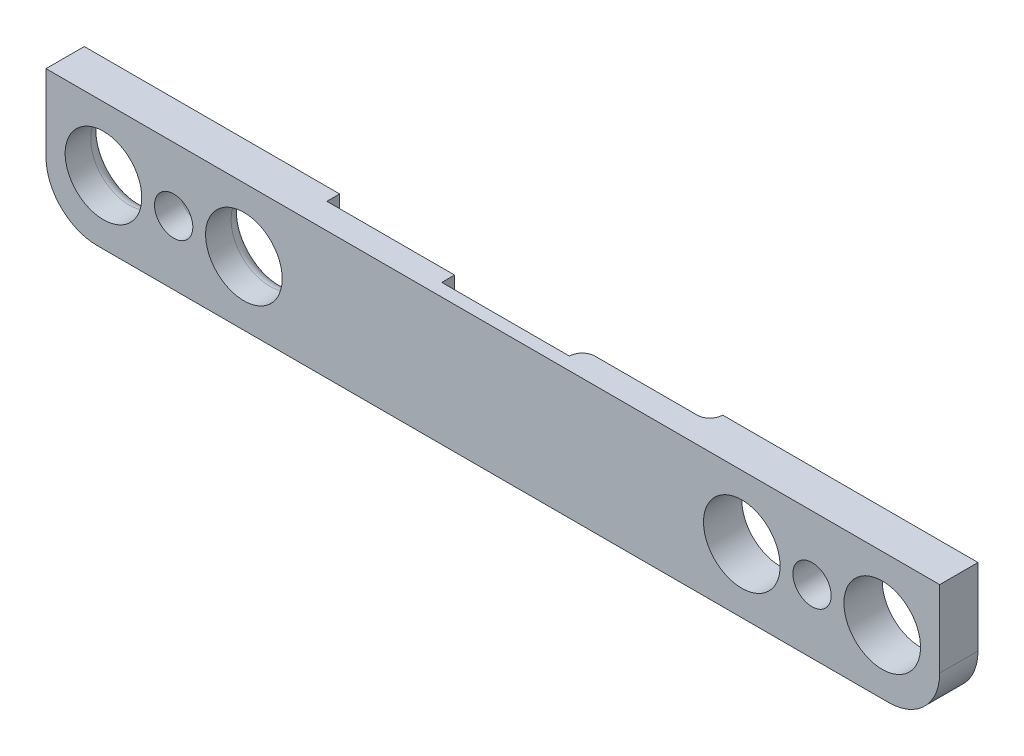
ISO-10303-21;
HEADER;
FILE_DESCRIPTION(('STEP AP214'),'2;1');
FILE_NAME('part.step','',(''),(''),'','','');
FILE_SCHEMA(('AUTOMOTIVE_DESIGN { 1 0 10303 214 1 1 1 1 }'));
ENDSEC;
DATA;
#1=APPLICATION_CONTEXT('core data for automotive mechanical design processes');
#2=APPLICATION_PROTOCOL_DEFINITION('international standard','automotive_design',2000,#1);
#3=PRODUCT_CONTEXT('',#1,'mechanical');
#4=PRODUCT('Part','Part','',(#3));
#5=PRODUCT_RELATED_PRODUCT_CATEGORY('part','',(#4));
#6=PRODUCT_DEFINITION_FORMATION('','',#4);
#7=PRODUCT_DEFINITION_CONTEXT('part definition',#1,'design');
#8=PRODUCT_DEFINITION('design','',#6,#7);
#9=PRODUCT_DEFINITION_SHAPE('','',#8);
#10=(LENGTH_UNIT() NAMED_UNIT(*) SI_UNIT(.MILLI.,.METRE.));
#11=(NAMED_UNIT(*) PLANE_ANGLE_UNIT() SI_UNIT($,.RADIAN.));
#12=(NAMED_UNIT(*) SI_UNIT($,.STERADIAN.) SOLID_ANGLE_UNIT());
#13=UNCERTAINTY_MEASURE_WITH_UNIT(LENGTH_MEASURE(1.E-05),#10,'distance_accuracy_value','');
#14=(GEOMETRIC_REPRESENTATION_CONTEXT(3) GLOBAL_UNCERTAINTY_ASSIGNED_CONTEXT((#13)) GLOBAL_UNIT_ASSIGNED_CONTEXT((#10,
#11,#12)) REPRESENTATION_CONTEXT('',''));
#15=CARTESIAN_POINT('',(0.,0.,0.));
#16=DIRECTION('',(0.,0.,1.));
#17=DIRECTION('',(1.,0.,0.));
#18=AXIS2_PLACEMENT_3D('',#15,#16,#17);
#19=CARTESIAN_POINT('',(21.1434977578475,6.18834080717489,1.));
#20=DIRECTION('',(1.,0.,0.));
#21=DIRECTION('',(0.,0.,-1.));
#22=AXIS2_PLACEMENT_3D('',#19,#20,#21);
#23=PLANE('',#22);
#24=DIRECTION('',(0.,0.,1.));
#25=VECTOR('',#24,1.);
#26=CARTESIAN_POINT('',(21.1434977578475,6.18834080717489,1.));
#27=LINE('',#26,#25);
#28=CARTESIAN_POINT('',(21.1434977578475,6.18834080717489,1.));
#29=VERTEX_POINT('',#28);
#30=CARTESIAN_POINT('',(21.1434977578475,6.18834080717489,2.));
#31=VERTEX_POINT('',#30);
#32=EDGE_CURVE('E446',#29,#31,#27,.T.);
#33=ORIENTED_EDGE('',*,*,#32,.T.);
#34=DIRECTION('',(0.,-1.,0.));
#35=VECTOR('',#34,1.);
#36=CARTESIAN_POINT('',(21.1434977578475,6.18834080717489,2.));
#37=LINE('',#36,#35);
#38=CARTESIAN_POINT('',(21.1434977578475,-3.81165919282511,2.));
#39=VERTEX_POINT('',#38);
#40=EDGE_CURVE('E174',#31,#39,#37,.T.);
#41=ORIENTED_EDGE('',*,*,#40,.T.);
#42=DIRECTION('',(0.,0.,1.));
#43=VECTOR('',#42,1.);
#44=CARTESIAN_POINT('',(21.1434977578475,-3.81165919282511,1.));
#45=LINE('',#44,#43);
#46=CARTESIAN_POINT('',(21.1434977578475,-3.81165919282511,1.));
#47=VERTEX_POINT('',#46);
#48=EDGE_CURVE('E450',#47,#39,#45,.T.);
#49=ORIENTED_EDGE('',*,*,#48,.F.);
#50=DIRECTION('',(0.,1.,0.));
#51=VECTOR('',#50,1.);
#52=CARTESIAN_POINT('',(21.1434977578475,6.18834080717489,1.));
#53=LINE('',#52,#51);
#54=EDGE_CURVE('E437',#47,#29,#53,.T.);
#55=ORIENTED_EDGE('',*,*,#54,.T.);
#56=EDGE_LOOP('',(#33,#41,#49,#55));
#57=FACE_BOUND('',#56,.T.);
#58=ADVANCED_FACE('F35',(#57),#23,.T.);
#59=CARTESIAN_POINT('',(0.,0.,3.));
#60=DIRECTION('',(0.,0.,1.));
#61=DIRECTION('',(1.,0.,0.));
#62=AXIS2_PLACEMENT_3D('',#59,#60,#61);
#63=PLANE('',#62);
#64=DIRECTION('',(0.,-1.,0.));
#65=VECTOR('',#64,1.);
#66=CARTESIAN_POINT('',(-8.85650224215246,6.18834080717489,3.));
#67=LINE('',#66,#65);
#68=CARTESIAN_POINT('',(-8.85650224215246,6.18834080717489,3.));
#69=VERTEX_POINT('',#68);
#70=CARTESIAN_POINT('',(-8.85650224215246,0.188340807174886,3.));
#71=VERTEX_POINT('',#70);
#72=EDGE_CURVE('E417',#69,#71,#67,.T.);
#73=ORIENTED_EDGE('',*,*,#72,.T.);
#74=CARTESIAN_POINT('',(-4.85650224215246,0.188340807174886,3.));
#75=DIRECTION('',(0.,0.,1.));
#76=DIRECTION('',(1.,0.,0.));
#77=AXIS2_PLACEMENT_3D('',#74,#75,#76);
#78=CIRCLE('',#77,4.);
#79=CARTESIAN_POINT('',(-4.85650224215246,-3.81165919282511,3.));
#80=VERTEX_POINT('',#79);
#81=EDGE_CURVE('E466',#71,#80,#78,.T.);
#82=ORIENTED_EDGE('',*,*,#81,.T.);
#83=DIRECTION('',(1.,0.,0.));
#84=VECTOR('',#83,1.);
#85=CARTESIAN_POINT('',(-8.85650224215246,-3.81165919282511,3.));
#86=LINE('',#85,#84);
#87=CARTESIAN_POINT('',(57.1434977578475,-3.81165919282511,3.));
#88=VERTEX_POINT('',#87);
#89=EDGE_CURVE('E485',#80,#88,#86,.T.);
#90=ORIENTED_EDGE('',*,*,#89,.T.);
#91=CARTESIAN_POINT('',(57.1434977578475,0.188340807174886,3.));
#92=DIRECTION('',(0.,0.,1.));
#93=DIRECTION('',(1.,0.,0.));
#94=AXIS2_PLACEMENT_3D('',#91,#92,#93);
#95=CIRCLE('',#94,4.);
#96=CARTESIAN_POINT('',(61.1434977578476,0.188340807174886,3.));
#97=VERTEX_POINT('',#96);
#98=EDGE_CURVE('E464',#88,#97,#95,.T.);
#99=ORIENTED_EDGE('',*,*,#98,.T.);
#100=DIRECTION('',(0.,-1.,0.));
#101=VECTOR('',#100,1.);
#102=CARTESIAN_POINT('',(61.1434977578476,6.18834080717489,3.));
#103=LINE('',#102,#101);
#104=CARTESIAN_POINT('',(61.1434977578476,6.18834080717489,3.));
#105=VERTEX_POINT('',#104);
#106=EDGE_CURVE('E213',#105,#97,#103,.T.);
#107=ORIENTED_EDGE('',*,*,#106,.F.);
#108=DIRECTION('',(-1.,0.,0.));
#109=VECTOR('',#108,1.);
#110=CARTESIAN_POINT('',(-8.85650224215246,6.18834080717489,3.));
#111=LINE('',#110,#109);
#112=EDGE_CURVE('E422',#105,#69,#111,.T.);
#113=ORIENTED_EDGE('',*,*,#112,.T.);
#114=EDGE_LOOP('',(#73,#82,#90,#99,#107,#113));
#115=FACE_BOUND('',#114,.T.);
#116=CARTESIAN_POINT('',(6.64349775784754,1.18834080717489,3.));
#117=DIRECTION('',(0.,0.,1.));
#118=DIRECTION('',(1.,0.,0.));
#119=AXIS2_PLACEMENT_3D('',#116,#117,#118);
#120=CIRCLE('',#119,3.);
#121=CARTESIAN_POINT('',(9.64349775784754,1.18834080717489,3.));
#122=VERTEX_POINT('',#121);
#123=EDGE_CURVE('E508',#122,#122,#120,.T.);
#124=ORIENTED_EDGE('',*,*,#123,.F.);
#125=EDGE_LOOP('',(#124));
#126=FACE_BOUND('',#125,.T.);
#127=CARTESIAN_POINT('',(-4.35650224215246,1.18834080717489,3.));
#128=DIRECTION('',(0.,0.,1.));
#129=DIRECTION('',(1.,0.,0.));
#130=AXIS2_PLACEMENT_3D('',#127,#128,#129);
#131=CIRCLE('',#130,3.);
#132=CARTESIAN_POINT('',(-1.35650224215246,1.18834080717489,3.));
#133=VERTEX_POINT('',#132);
#134=EDGE_CURVE('E412',#133,#133,#131,.T.);
#135=ORIENTED_EDGE('',*,*,#134,.F.);
#136=EDGE_LOOP('',(#135));
#137=FACE_BOUND('',#136,.T.);
#138=CARTESIAN_POINT('',(1.14349775784754,1.18834080717489,3.));
#139=DIRECTION('',(0.,0.,1.));
#140=DIRECTION('',(1.,0.,0.));
#141=AXIS2_PLACEMENT_3D('',#138,#139,#140);
#142=CIRCLE('',#141,1.5);
#143=CARTESIAN_POINT('',(2.64349775784754,1.18834080717489,3.));
#144=VERTEX_POINT('',#143);
#145=EDGE_CURVE('E449',#144,#144,#142,.T.);
#146=ORIENTED_EDGE('',*,*,#145,.F.);
#147=EDGE_LOOP('',(#146));
#148=FACE_BOUND('',#147,.T.);
#149=CARTESIAN_POINT('',(45.6434977578475,1.18834080717489,3.));
#150=DIRECTION('',(0.,0.,-1.));
#151=DIRECTION('',(-1.,0.,0.));
#152=AXIS2_PLACEMENT_3D('',#149,#150,#151);
#153=CIRCLE('',#152,3.);
#154=CARTESIAN_POINT('',(42.6434977578475,1.18834080717489,3.));
#155=VERTEX_POINT('',#154);
#156=EDGE_CURVE('E201',#155,#155,#153,.T.);
#157=ORIENTED_EDGE('',*,*,#156,.T.);
#158=EDGE_LOOP('',(#157));
#159=FACE_BOUND('',#158,.T.);
#160=CARTESIAN_POINT('',(56.6434977578475,1.18834080717489,3.));
#161=DIRECTION('',(0.,0.,-1.));
#162=DIRECTION('',(-1.,0.,0.));
#163=AXIS2_PLACEMENT_3D('',#160,#161,#162);
#164=CIRCLE('',#163,3.);
#165=CARTESIAN_POINT('',(53.6434977578475,1.18834080717489,3.));
#166=VERTEX_POINT('',#165);
#167=EDGE_CURVE('E207',#166,#166,#164,.T.);
#168=ORIENTED_EDGE('',*,*,#167,.T.);
#169=EDGE_LOOP('',(#168));
#170=FACE_BOUND('',#169,.T.);
#171=CARTESIAN_POINT('',(51.1434977578475,1.18834080717489,3.));
#172=DIRECTION('',(0.,0.,-1.));
#173=DIRECTION('',(-1.,0.,0.));
#174=AXIS2_PLACEMENT_3D('',#171,#172,#173);
#175=CIRCLE('',#174,1.5);
#176=CARTESIAN_POINT('',(49.6434977578475,1.18834080717489,3.));
#177=VERTEX_POINT('',#176);
#178=EDGE_CURVE('E194',#177,#177,#175,.T.);
#179=ORIENTED_EDGE('',*,*,#178,.T.);
#180=EDGE_LOOP('',(#179));
#181=FACE_BOUND('',#180,.T.);
#182=ADVANCED_FACE('F282',(#115,#126,#137,#148,#159,#170,#181),#63,.T.);
#183=CARTESIAN_POINT('',(0.,0.,0.));
#184=DIRECTION('',(0.,0.,1.));
#185=DIRECTION('',(1.,0.,0.));
#186=AXIS2_PLACEMENT_3D('',#183,#184,#185);
#187=PLANE('',#186);
#188=CARTESIAN_POINT('',(1.14349775784754,1.18834080717489,0.));
#189=DIRECTION('',(0.,0.,1.));
#190=DIRECTION('',(1.,0.,0.));
#191=AXIS2_PLACEMENT_3D('',#188,#189,#190);
#192=CIRCLE('',#191,2.5);
#193=CARTESIAN_POINT('',(3.00713412148391,2.85473196897701,0.));
#194=VERTEX_POINT('',#193);
#195=CARTESIAN_POINT('',(-0.72013860578882,2.85473196897701,0.));
#196=VERTEX_POINT('',#195);
#197=EDGE_CURVE('E251',#194,#196,#192,.T.);
#198=ORIENTED_EDGE('',*,*,#197,.T.);
#199=CARTESIAN_POINT('',(-4.35650224215246,1.18834080717489,0.));
#200=DIRECTION('',(0.,0.,1.));
#201=DIRECTION('',(1.,0.,0.));
#202=AXIS2_PLACEMENT_3D('',#199,#200,#201);
#203=CIRCLE('',#202,4.);
#204=CARTESIAN_POINT('',(-0.72013860578882,-0.478050354627238,0.));
#205=VERTEX_POINT('',#204);
#206=EDGE_CURVE('E63',#196,#205,#203,.T.);
#207=ORIENTED_EDGE('',*,*,#206,.T.);
#208=CARTESIAN_POINT('',(1.14349775784754,1.18834080717489,0.));
#209=DIRECTION('',(0.,0.,1.));
#210=DIRECTION('',(1.,0.,0.));
#211=AXIS2_PLACEMENT_3D('',#208,#209,#210);
#212=CIRCLE('',#211,2.5);
#213=CARTESIAN_POINT('',(3.00713412148391,-0.478050354627236,0.));
#214=VERTEX_POINT('',#213);
#215=EDGE_CURVE('E249',#205,#214,#212,.T.);
#216=ORIENTED_EDGE('',*,*,#215,.T.);
#217=CARTESIAN_POINT('',(6.64349775784754,1.18834080717489,0.));
#218=DIRECTION('',(0.,0.,1.));
#219=DIRECTION('',(1.,0.,0.));
#220=AXIS2_PLACEMENT_3D('',#217,#218,#219);
#221=CIRCLE('',#220,4.);
#222=EDGE_CURVE('E247',#214,#194,#221,.T.);
#223=ORIENTED_EDGE('',*,*,#222,.T.);
#224=EDGE_LOOP('',(#198,#207,#216,#223));
#225=FACE_BOUND('',#224,.T.);
#226=DIRECTION('',(1.,0.,0.));
#227=VECTOR('',#226,1.);
#228=CARTESIAN_POINT('',(-8.85650224215246,-3.81165919282511,0.));
#229=LINE('',#228,#227);
#230=CARTESIAN_POINT('',(-4.85650224215246,-3.81165919282511,0.));
#231=VERTEX_POINT('',#230);
#232=CARTESIAN_POINT('',(11.1434977578475,-3.81165919282511,0.));
#233=VERTEX_POINT('',#232);
#234=EDGE_CURVE('E398',#231,#233,#229,.T.);
#235=ORIENTED_EDGE('',*,*,#234,.F.);
#236=CARTESIAN_POINT('',(-4.85650224215246,0.188340807174886,0.));
#237=DIRECTION('',(0.,0.,1.));
#238=DIRECTION('',(1.,0.,0.));
#239=AXIS2_PLACEMENT_3D('',#236,#237,#238);
#240=CIRCLE('',#239,4.);
#241=CARTESIAN_POINT('',(-8.85650224215246,0.188340807174886,0.));
#242=VERTEX_POINT('',#241);
#243=EDGE_CURVE('E400',#231,#242,#240,.F.);
#244=ORIENTED_EDGE('',*,*,#243,.T.);
#245=DIRECTION('',(0.,-1.,0.));
#246=VECTOR('',#245,1.);
#247=CARTESIAN_POINT('',(-8.85650224215246,6.18834080717489,0.));
#248=LINE('',#247,#246);
#249=CARTESIAN_POINT('',(-8.85650224215246,6.18834080717489,0.));
#250=VERTEX_POINT('',#249);
#251=EDGE_CURVE('E408',#250,#242,#248,.T.);
#252=ORIENTED_EDGE('',*,*,#251,.F.);
#253=DIRECTION('',(-1.,0.,0.));
#254=VECTOR('',#253,1.);
#255=CARTESIAN_POINT('',(-8.85650224215246,6.18834080717489,0.));
#256=LINE('',#255,#254);
#257=CARTESIAN_POINT('',(11.1434977578475,6.18834080717489,0.));
#258=VERTEX_POINT('',#257);
#259=EDGE_CURVE('E410',#258,#250,#256,.T.);
#260=ORIENTED_EDGE('',*,*,#259,.F.);
#261=DIRECTION('',(0.,1.,0.));
#262=VECTOR('',#261,1.);
#263=CARTESIAN_POINT('',(11.1434977578475,6.18834080717489,0.));
#264=LINE('',#263,#262);
#265=EDGE_CURVE('E404',#233,#258,#264,.T.);
#266=ORIENTED_EDGE('',*,*,#265,.F.);
#267=EDGE_LOOP('',(#235,#244,#252,#260,#266));
#268=FACE_BOUND('',#267,.T.);
#269=ADVANCED_FACE('F288',(#225,#268),#187,.F.);
#270=CARTESIAN_POINT('',(-8.85650224215246,6.18834080717489,3.));
#271=DIRECTION('',(1.,0.,0.));
#272=DIRECTION('',(0.,0.,-1.));
#273=AXIS2_PLACEMENT_3D('',#270,#271,#272);
#274=PLANE('',#273);
#275=ORIENTED_EDGE('',*,*,#251,.T.);
#276=DIRECTION('',(0.,0.,-1.));
#277=VECTOR('',#276,1.);
#278=CARTESIAN_POINT('',(-8.85650224215246,0.188340807174886,3.));
#279=LINE('',#278,#277);
#280=EDGE_CURVE('E462',#242,#71,#279,.F.);
#281=ORIENTED_EDGE('',*,*,#280,.T.);
#282=ORIENTED_EDGE('',*,*,#72,.F.);
#283=DIRECTION('',(0.,0.,-1.));
#284=VECTOR('',#283,1.);
#285=CARTESIAN_POINT('',(-8.85650224215246,6.18834080717489,3.));
#286=LINE('',#285,#284);
#287=EDGE_CURVE('E418',#69,#250,#286,.T.);
#288=ORIENTED_EDGE('',*,*,#287,.T.);
#289=EDGE_LOOP('',(#275,#281,#282,#288));
#290=FACE_BOUND('',#289,.T.);
#291=ADVANCED_FACE('F309',(#290),#274,.F.);
#292=CARTESIAN_POINT('',(-8.85650224215246,-3.81165919282511,3.));
#293=DIRECTION('',(0.,1.,0.));
#294=DIRECTION('',(0.,0.,1.));
#295=AXIS2_PLACEMENT_3D('',#292,#293,#294);
#296=PLANE('',#295);
#297=DIRECTION('',(1.,0.,0.));
#298=VECTOR('',#297,1.);
#299=CARTESIAN_POINT('',(21.1434977578475,-3.81165919282511,2.));
#300=LINE('',#299,#298);
#301=CARTESIAN_POINT('',(31.1434977578475,-3.81165919282511,2.));
#302=VERTEX_POINT('',#301);
#303=EDGE_CURVE('E176',#39,#302,#300,.T.);
#304=ORIENTED_EDGE('',*,*,#303,.T.);
#305=CARTESIAN_POINT('',(32.1434977578475,-3.81165919282511,2.));
#306=DIRECTION('',(0.,1.,0.));
#307=DIRECTION('',(0.,0.,1.));
#308=AXIS2_PLACEMENT_3D('',#305,#306,#307);
#309=CIRCLE('',#308,1.);
#310=CARTESIAN_POINT('',(32.1434977578475,-3.81165919282511,1.));
#311=VERTEX_POINT('',#310);
#312=EDGE_CURVE('E166',#302,#311,#309,.F.);
#313=ORIENTED_EDGE('',*,*,#312,.T.);
#314=DIRECTION('',(-1.,0.,0.));
#315=VECTOR('',#314,1.);
#316=CARTESIAN_POINT('',(41.1434977578475,-3.81165919282511,1.));
#317=LINE('',#316,#315);
#318=CARTESIAN_POINT('',(40.1434977578475,-3.81165919282511,1.));
#319=VERTEX_POINT('',#318);
#320=EDGE_CURVE('E180',#319,#311,#317,.T.);
#321=ORIENTED_EDGE('',*,*,#320,.F.);
#322=CARTESIAN_POINT('',(40.1434977578475,-3.81165919282511,0.));
#323=DIRECTION('',(0.,1.,0.));
#324=DIRECTION('',(0.,0.,1.));
#325=AXIS2_PLACEMENT_3D('',#322,#323,#324);
#326=CIRCLE('',#325,1.);
#327=CARTESIAN_POINT('',(41.1434977578475,-3.81165919282511,0.));
#328=VERTEX_POINT('',#327);
#329=EDGE_CURVE('E241',#319,#328,#326,.T.);
#330=ORIENTED_EDGE('',*,*,#329,.T.);
#331=DIRECTION('',(-1.,0.,0.));
#332=VECTOR('',#331,1.);
#333=CARTESIAN_POINT('',(61.1434977578476,-3.81165919282511,0.));
#334=LINE('',#333,#332);
#335=CARTESIAN_POINT('',(57.1434977578475,-3.81165919282511,0.));
#336=VERTEX_POINT('',#335);
#337=EDGE_CURVE('E220',#336,#328,#334,.T.);
#338=ORIENTED_EDGE('',*,*,#337,.F.);
#339=DIRECTION('',(0.,0.,-1.));
#340=VECTOR('',#339,1.);
#341=CARTESIAN_POINT('',(57.1434977578475,-3.81165919282511,3.));
#342=LINE('',#341,#340);
#343=EDGE_CURVE('E430',#336,#88,#342,.F.);
#344=ORIENTED_EDGE('',*,*,#343,.T.);
#345=ORIENTED_EDGE('',*,*,#89,.F.);
#346=DIRECTION('',(0.,0.,-1.));
#347=VECTOR('',#346,1.);
#348=CARTESIAN_POINT('',(-4.85650224215246,-3.81165919282511,3.));
#349=LINE('',#348,#347);
#350=EDGE_CURVE('E459',#80,#231,#349,.T.);
#351=ORIENTED_EDGE('',*,*,#350,.T.);
#352=ORIENTED_EDGE('',*,*,#234,.T.);
#353=DIRECTION('',(0.,0.,-1.));
#354=VECTOR('',#353,1.);
#355=CARTESIAN_POINT('',(11.1434977578475,-3.81165919282511,3.));
#356=LINE('',#355,#354);
#357=CARTESIAN_POINT('',(11.1434977578475,-3.81165919282511,1.));
#358=VERTEX_POINT('',#357);
#359=EDGE_CURVE('E428',#358,#233,#356,.T.);
#360=ORIENTED_EDGE('',*,*,#359,.F.);
#361=DIRECTION('',(1.,0.,0.));
#362=VECTOR('',#361,1.);
#363=CARTESIAN_POINT('',(11.1434977578475,-3.81165919282511,1.));
#364=LINE('',#363,#362);
#365=EDGE_CURVE('E433',#358,#47,#364,.T.);
#366=ORIENTED_EDGE('',*,*,#365,.T.);
#367=ORIENTED_EDGE('',*,*,#48,.T.);
#368=EDGE_LOOP('',(#304,#313,#321,#330,#338,#344,#345,#351,#352,#360,#366,#367));
#369=FACE_BOUND('',#368,.T.);
#370=ADVANCED_FACE('F315',(#369),#296,.F.);
#371=CARTESIAN_POINT('',(11.1434977578475,6.18834080717489,3.));
#372=DIRECTION('',(-1.,0.,0.));
#373=DIRECTION('',(0.,0.,1.));
#374=AXIS2_PLACEMENT_3D('',#371,#372,#373);
#375=PLANE('',#374);
#376=DIRECTION('',(0.,0.,-1.));
#377=VECTOR('',#376,1.);
#378=CARTESIAN_POINT('',(11.1434977578475,6.18834080717489,3.));
#379=LINE('',#378,#377);
#380=CARTESIAN_POINT('',(11.1434977578475,6.18834080717489,1.));
#381=VERTEX_POINT('',#380);
#382=EDGE_CURVE('E421',#381,#258,#379,.T.);
#383=ORIENTED_EDGE('',*,*,#382,.F.);
#384=DIRECTION('',(0.,-1.,0.));
#385=VECTOR('',#384,1.);
#386=CARTESIAN_POINT('',(11.1434977578475,6.18834080717489,1.));
#387=LINE('',#386,#385);
#388=EDGE_CURVE('E175',#381,#358,#387,.T.);
#389=ORIENTED_EDGE('',*,*,#388,.T.);
#390=ORIENTED_EDGE('',*,*,#359,.T.);
#391=ORIENTED_EDGE('',*,*,#265,.T.);
#392=EDGE_LOOP('',(#383,#389,#390,#391));
#393=FACE_BOUND('',#392,.T.);
#394=ADVANCED_FACE('F312',(#393),#375,.F.);
#395=CARTESIAN_POINT('',(-8.85650224215246,6.18834080717489,3.));
#396=DIRECTION('',(0.,-1.,0.));
#397=DIRECTION('',(0.,0.,-1.));
#398=AXIS2_PLACEMENT_3D('',#395,#396,#397);
#399=PLANE('',#398);
#400=DIRECTION('',(1.,0.,0.));
#401=VECTOR('',#400,1.);
#402=CARTESIAN_POINT('',(41.1434977578475,6.18834080717489,1.));
#403=LINE('',#402,#401);
#404=CARTESIAN_POINT('',(32.1434977578475,6.18834080717489,1.));
#405=VERTEX_POINT('',#404);
#406=CARTESIAN_POINT('',(40.1434977578475,6.18834080717489,1.));
#407=VERTEX_POINT('',#406);
#408=EDGE_CURVE('E161',#405,#407,#403,.T.);
#409=ORIENTED_EDGE('',*,*,#408,.F.);
#410=CARTESIAN_POINT('',(32.1434977578475,6.18834080717489,2.));
#411=DIRECTION('',(0.,-1.,0.));
#412=DIRECTION('',(0.,0.,-1.));
#413=AXIS2_PLACEMENT_3D('',#410,#411,#412);
#414=CIRCLE('',#413,1.);
#415=CARTESIAN_POINT('',(31.1434977578475,6.18834080717489,2.));
#416=VERTEX_POINT('',#415);
#417=EDGE_CURVE('E155',#405,#416,#414,.F.);
#418=ORIENTED_EDGE('',*,*,#417,.T.);
#419=DIRECTION('',(-1.,0.,0.));
#420=VECTOR('',#419,1.);
#421=CARTESIAN_POINT('',(21.1434977578475,6.18834080717489,2.));
#422=LINE('',#421,#420);
#423=EDGE_CURVE('E158',#416,#31,#422,.T.);
#424=ORIENTED_EDGE('',*,*,#423,.T.);
#425=ORIENTED_EDGE('',*,*,#32,.F.);
#426=DIRECTION('',(-1.,0.,0.));
#427=VECTOR('',#426,1.);
#428=CARTESIAN_POINT('',(11.1434977578475,6.18834080717489,1.));
#429=LINE('',#428,#427);
#430=EDGE_CURVE('E440',#29,#381,#429,.T.);
#431=ORIENTED_EDGE('',*,*,#430,.T.);
#432=ORIENTED_EDGE('',*,*,#382,.T.);
#433=ORIENTED_EDGE('',*,*,#259,.T.);
#434=ORIENTED_EDGE('',*,*,#287,.F.);
#435=ORIENTED_EDGE('',*,*,#112,.F.);
#436=DIRECTION('',(0.,0.,-1.));
#437=VECTOR('',#436,1.);
#438=CARTESIAN_POINT('',(61.1434977578476,6.18834080717489,3.));
#439=LINE('',#438,#437);
#440=CARTESIAN_POINT('',(61.1434977578476,6.18834080717489,0.));
#441=VERTEX_POINT('',#440);
#442=EDGE_CURVE('E216',#105,#441,#439,.T.);
#443=ORIENTED_EDGE('',*,*,#442,.T.);
#444=DIRECTION('',(1.,0.,0.));
#445=VECTOR('',#444,1.);
#446=CARTESIAN_POINT('',(61.1434977578476,6.18834080717489,0.));
#447=LINE('',#446,#445);
#448=CARTESIAN_POINT('',(41.1434977578475,6.18834080717489,0.));
#449=VERTEX_POINT('',#448);
#450=EDGE_CURVE('E217',#449,#441,#447,.T.);
#451=ORIENTED_EDGE('',*,*,#450,.F.);
#452=CARTESIAN_POINT('',(40.1434977578475,6.18834080717489,0.));
#453=DIRECTION('',(0.,-1.,0.));
#454=DIRECTION('',(0.,0.,-1.));
#455=AXIS2_PLACEMENT_3D('',#452,#453,#454);
#456=CIRCLE('',#455,1.);
#457=EDGE_CURVE('E245',#449,#407,#456,.T.);
#458=ORIENTED_EDGE('',*,*,#457,.T.);
#459=EDGE_LOOP('',(#409,#418,#424,#425,#431,#432,#433,#434,#435,#443,#451,#458));
#460=FACE_BOUND('',#459,.T.);
#461=ADVANCED_FACE('F157',(#460),#399,.F.);
#462=CARTESIAN_POINT('',(-4.35650224215246,1.18834080717489,3.));
#463=DIRECTION('',(0.,0.,-1.));
#464=DIRECTION('',(-1.,0.,0.));
#465=AXIS2_PLACEMENT_3D('',#462,#463,#464);
#466=CYLINDRICAL_SURFACE('',#465,3.);
#467=CARTESIAN_POINT('',(-4.35650224215246,1.18834080717489,1.));
#468=DIRECTION('',(0.,0.,1.));
#469=DIRECTION('',(1.,0.,0.));
#470=AXIS2_PLACEMENT_3D('',#467,#468,#469);
#471=CIRCLE('',#470,3.);
#472=CARTESIAN_POINT('',(-1.35650224215246,1.18834080717489,1.));
#473=VERTEX_POINT('',#472);
#474=EDGE_CURVE('E48',#473,#473,#471,.F.);
#475=ORIENTED_EDGE('',*,*,#474,.T.);
#476=EDGE_LOOP('',(#475));
#477=FACE_BOUND('',#476,.T.);
#478=ORIENTED_EDGE('',*,*,#134,.T.);
#479=EDGE_LOOP('',(#478));
#480=FACE_BOUND('',#479,.T.);
#481=ADVANCED_FACE('F302',(#477,#480),#466,.F.);
#482=CARTESIAN_POINT('',(6.64349775784754,1.18834080717489,3.));
#483=DIRECTION('',(0.,0.,-1.));
#484=DIRECTION('',(-1.,0.,0.));
#485=AXIS2_PLACEMENT_3D('',#482,#483,#484);
#486=CYLINDRICAL_SURFACE('',#485,3.);
#487=CARTESIAN_POINT('',(6.64349775784754,1.18834080717489,1.));
#488=DIRECTION('',(0.,0.,1.));
#489=DIRECTION('',(1.,0.,0.));
#490=AXIS2_PLACEMENT_3D('',#487,#488,#489);
#491=CIRCLE('',#490,3.);
#492=CARTESIAN_POINT('',(9.64349775784754,1.18834080717489,1.));
#493=VERTEX_POINT('',#492);
#494=EDGE_CURVE('E11',#493,#493,#491,.F.);
#495=ORIENTED_EDGE('',*,*,#494,.T.);
#496=EDGE_LOOP('',(#495));
#497=FACE_BOUND('',#496,.T.);
#498=ORIENTED_EDGE('',*,*,#123,.T.);
#499=EDGE_LOOP('',(#498));
#500=FACE_BOUND('',#499,.T.);
#501=ADVANCED_FACE('F298',(#497,#500),#486,.F.);
#502=CARTESIAN_POINT('',(1.14349775784754,1.18834080717489,3.));
#503=DIRECTION('',(0.,0.,-1.));
#504=DIRECTION('',(-1.,0.,0.));
#505=AXIS2_PLACEMENT_3D('',#502,#503,#504);
#506=CYLINDRICAL_SURFACE('',#505,1.5);
#507=CARTESIAN_POINT('',(1.14349775784754,1.18834080717489,1.));
#508=DIRECTION('',(0.,0.,1.));
#509=DIRECTION('',(1.,0.,0.));
#510=AXIS2_PLACEMENT_3D('',#507,#508,#509);
#511=CIRCLE('',#510,1.5);
#512=CARTESIAN_POINT('',(2.64349775784754,1.18834080717489,1.));
#513=VERTEX_POINT('',#512);
#514=EDGE_CURVE('E254',#513,#513,#511,.F.);
#515=ORIENTED_EDGE('',*,*,#514,.T.);
#516=EDGE_LOOP('',(#515));
#517=FACE_BOUND('',#516,.T.);
#518=ORIENTED_EDGE('',*,*,#145,.T.);
#519=EDGE_LOOP('',(#518));
#520=FACE_BOUND('',#519,.T.);
#521=ADVANCED_FACE('F295',(#517,#520),#506,.F.);
#522=CARTESIAN_POINT('',(0.,0.,1.));
#523=DIRECTION('',(0.,0.,1.));
#524=DIRECTION('',(1.,0.,0.));
#525=AXIS2_PLACEMENT_3D('',#522,#523,#524);
#526=PLANE('',#525);
#527=ORIENTED_EDGE('',*,*,#388,.F.);
#528=ORIENTED_EDGE('',*,*,#430,.F.);
#529=ORIENTED_EDGE('',*,*,#54,.F.);
#530=ORIENTED_EDGE('',*,*,#365,.F.);
#531=EDGE_LOOP('',(#527,#528,#529,#530));
#532=FACE_BOUND('',#531,.T.);
#533=ADVANCED_FACE('F293',(#532),#526,.F.);
#534=CARTESIAN_POINT('',(0.,0.,2.));
#535=DIRECTION('',(0.,0.,1.));
#536=DIRECTION('',(1.,0.,0.));
#537=AXIS2_PLACEMENT_3D('',#534,#535,#536);
#538=PLANE('',#537);
#539=ORIENTED_EDGE('',*,*,#40,.F.);
#540=ORIENTED_EDGE('',*,*,#423,.F.);
#541=DIRECTION('',(0.,-1.,0.));
#542=VECTOR('',#541,1.);
#543=CARTESIAN_POINT('',(31.1434977578475,6.18834080717489,2.));
#544=LINE('',#543,#542);
#545=EDGE_CURVE('E171',#416,#302,#544,.T.);
#546=ORIENTED_EDGE('',*,*,#545,.T.);
#547=ORIENTED_EDGE('',*,*,#303,.F.);
#548=EDGE_LOOP('',(#539,#540,#546,#547));
#549=FACE_BOUND('',#548,.T.);
#550=ADVANCED_FACE('F170',(#549),#538,.F.);
#551=CARTESIAN_POINT('',(52.2869955156951,0.,0.));
#552=DIRECTION('',(0.,0.,1.));
#553=DIRECTION('',(-1.,0.,0.));
#554=AXIS2_PLACEMENT_3D('',#551,#552,#553);
#555=PLANE('',#554);
#556=CARTESIAN_POINT('',(45.6434977578475,1.18834080717489,0.));
#557=DIRECTION('',(0.,0.,-1.));
#558=DIRECTION('',(-1.,0.,0.));
#559=AXIS2_PLACEMENT_3D('',#556,#557,#558);
#560=CIRCLE('',#559,3.);
#561=CARTESIAN_POINT('',(42.6434977578475,1.18834080717489,0.));
#562=VERTEX_POINT('',#561);
#563=EDGE_CURVE('E197',#562,#562,#560,.T.);
#564=ORIENTED_EDGE('',*,*,#563,.F.);
#565=EDGE_LOOP('',(#564));
#566=FACE_BOUND('',#565,.T.);
#567=DIRECTION('',(0.,-1.,0.));
#568=VECTOR('',#567,1.);
#569=CARTESIAN_POINT('',(61.1434977578476,6.18834080717489,0.));
#570=LINE('',#569,#568);
#571=CARTESIAN_POINT('',(61.1434977578476,0.188340807174886,0.));
#572=VERTEX_POINT('',#571);
#573=EDGE_CURVE('E210',#441,#572,#570,.T.);
#574=ORIENTED_EDGE('',*,*,#573,.T.);
#575=CARTESIAN_POINT('',(57.1434977578475,0.188340807174886,0.));
#576=DIRECTION('',(0.,0.,1.));
#577=DIRECTION('',(1.,0.,0.));
#578=AXIS2_PLACEMENT_3D('',#575,#576,#577);
#579=CIRCLE('',#578,4.);
#580=EDGE_CURVE('E231',#572,#336,#579,.F.);
#581=ORIENTED_EDGE('',*,*,#580,.T.);
#582=ORIENTED_EDGE('',*,*,#337,.T.);
#583=DIRECTION('',(0.,1.,0.));
#584=VECTOR('',#583,1.);
#585=CARTESIAN_POINT('',(41.1434977578475,6.18834080717489,0.));
#586=LINE('',#585,#584);
#587=EDGE_CURVE('E223',#328,#449,#586,.T.);
#588=ORIENTED_EDGE('',*,*,#587,.T.);
#589=ORIENTED_EDGE('',*,*,#450,.T.);
#590=EDGE_LOOP('',(#574,#581,#582,#588,#589));
#591=FACE_BOUND('',#590,.T.);
#592=CARTESIAN_POINT('',(56.6434977578475,1.18834080717489,0.));
#593=DIRECTION('',(0.,0.,-1.));
#594=DIRECTION('',(-1.,0.,0.));
#595=AXIS2_PLACEMENT_3D('',#592,#593,#594);
#596=CIRCLE('',#595,3.);
#597=CARTESIAN_POINT('',(53.6434977578475,1.18834080717489,0.));
#598=VERTEX_POINT('',#597);
#599=EDGE_CURVE('E204',#598,#598,#596,.T.);
#600=ORIENTED_EDGE('',*,*,#599,.F.);
#601=EDGE_LOOP('',(#600));
#602=FACE_BOUND('',#601,.T.);
#603=CARTESIAN_POINT('',(51.1434977578475,1.18834080717489,0.));
#604=DIRECTION('',(0.,0.,-1.));
#605=DIRECTION('',(-1.,0.,0.));
#606=AXIS2_PLACEMENT_3D('',#603,#604,#605);
#607=CIRCLE('',#606,1.5);
#608=CARTESIAN_POINT('',(49.6434977578475,1.18834080717489,0.));
#609=VERTEX_POINT('',#608);
#610=EDGE_CURVE('E198',#609,#609,#607,.T.);
#611=ORIENTED_EDGE('',*,*,#610,.F.);
#612=EDGE_LOOP('',(#611));
#613=FACE_BOUND('',#612,.T.);
#614=ADVANCED_FACE('F474',(#566,#591,#602,#613),#555,.F.);
#615=CARTESIAN_POINT('',(61.1434977578476,6.18834080717489,3.));
#616=DIRECTION('',(-1.,0.,0.));
#617=DIRECTION('',(0.,0.,-1.));
#618=AXIS2_PLACEMENT_3D('',#615,#616,#617);
#619=PLANE('',#618);
#620=ORIENTED_EDGE('',*,*,#106,.T.);
#621=DIRECTION('',(0.,0.,-1.));
#622=VECTOR('',#621,1.);
#623=CARTESIAN_POINT('',(61.1434977578476,0.188340807174886,3.));
#624=LINE('',#623,#622);
#625=EDGE_CURVE('E467',#97,#572,#624,.T.);
#626=ORIENTED_EDGE('',*,*,#625,.T.);
#627=ORIENTED_EDGE('',*,*,#573,.F.);
#628=ORIENTED_EDGE('',*,*,#442,.F.);
#629=EDGE_LOOP('',(#620,#626,#627,#628));
#630=FACE_BOUND('',#629,.T.);
#631=ADVANCED_FACE('F487',(#630),#619,.F.);
#632=CARTESIAN_POINT('',(56.6434977578475,1.18834080717489,3.));
#633=DIRECTION('',(0.,0.,-1.));
#634=DIRECTION('',(1.,0.,0.));
#635=AXIS2_PLACEMENT_3D('',#632,#633,#634);
#636=CYLINDRICAL_SURFACE('',#635,3.);
#637=ORIENTED_EDGE('',*,*,#167,.F.);
#638=EDGE_LOOP('',(#637));
#639=FACE_BOUND('',#638,.T.);
#640=ORIENTED_EDGE('',*,*,#599,.T.);
#641=EDGE_LOOP('',(#640));
#642=FACE_BOUND('',#641,.T.);
#643=ADVANCED_FACE('F535',(#639,#642),#636,.F.);
#644=CARTESIAN_POINT('',(45.6434977578475,1.18834080717489,3.));
#645=DIRECTION('',(0.,0.,-1.));
#646=DIRECTION('',(1.,0.,0.));
#647=AXIS2_PLACEMENT_3D('',#644,#645,#646);
#648=CYLINDRICAL_SURFACE('',#647,3.);
#649=ORIENTED_EDGE('',*,*,#156,.F.);
#650=EDGE_LOOP('',(#649));
#651=FACE_BOUND('',#650,.T.);
#652=ORIENTED_EDGE('',*,*,#563,.T.);
#653=EDGE_LOOP('',(#652));
#654=FACE_BOUND('',#653,.T.);
#655=ADVANCED_FACE('F524',(#651,#654),#648,.F.);
#656=CARTESIAN_POINT('',(51.1434977578475,1.18834080717489,3.));
#657=DIRECTION('',(0.,0.,-1.));
#658=DIRECTION('',(1.,0.,0.));
#659=AXIS2_PLACEMENT_3D('',#656,#657,#658);
#660=CYLINDRICAL_SURFACE('',#659,1.5);
#661=ORIENTED_EDGE('',*,*,#178,.F.);
#662=EDGE_LOOP('',(#661));
#663=FACE_BOUND('',#662,.T.);
#664=ORIENTED_EDGE('',*,*,#610,.T.);
#665=EDGE_LOOP('',(#664));
#666=FACE_BOUND('',#665,.T.);
#667=ADVANCED_FACE('F521',(#663,#666),#660,.F.);
#668=CARTESIAN_POINT('',(52.2869955156951,0.,1.));
#669=DIRECTION('',(0.,0.,1.));
#670=DIRECTION('',(-1.,0.,0.));
#671=AXIS2_PLACEMENT_3D('',#668,#669,#670);
#672=PLANE('',#671);
#673=ORIENTED_EDGE('',*,*,#320,.T.);
#674=DIRECTION('',(0.,1.,0.));
#675=VECTOR('',#674,1.);
#676=CARTESIAN_POINT('',(32.1434977578475,6.18834080717489,1.));
#677=LINE('',#676,#675);
#678=EDGE_CURVE('E167',#311,#405,#677,.T.);
#679=ORIENTED_EDGE('',*,*,#678,.T.);
#680=ORIENTED_EDGE('',*,*,#408,.T.);
#681=DIRECTION('',(0.,-1.,0.));
#682=VECTOR('',#681,1.);
#683=CARTESIAN_POINT('',(40.1434977578475,-3.81165919282511,1.));
#684=LINE('',#683,#682);
#685=EDGE_CURVE('E234',#407,#319,#684,.T.);
#686=ORIENTED_EDGE('',*,*,#685,.T.);
#687=EDGE_LOOP('',(#673,#679,#680,#686));
#688=FACE_BOUND('',#687,.T.);
#689=ADVANCED_FACE('F327',(#688),#672,.F.);
#690=CARTESIAN_POINT('',(-4.85650224215246,0.188340807174886,3.));
#691=DIRECTION('',(0.,0.,-1.));
#692=DIRECTION('',(-1.,0.,0.));
#693=AXIS2_PLACEMENT_3D('',#690,#691,#692);
#694=CYLINDRICAL_SURFACE('',#693,4.);
#695=ORIENTED_EDGE('',*,*,#81,.F.);
#696=ORIENTED_EDGE('',*,*,#280,.F.);
#697=ORIENTED_EDGE('',*,*,#243,.F.);
#698=ORIENTED_EDGE('',*,*,#350,.F.);
#699=EDGE_LOOP('',(#695,#696,#697,#698));
#700=FACE_BOUND('',#699,.T.);
#701=ADVANCED_FACE('F323',(#700),#694,.T.);
#702=CARTESIAN_POINT('',(57.1434977578475,0.188340807174886,3.));
#703=DIRECTION('',(0.,0.,-1.));
#704=DIRECTION('',(-1.,0.,0.));
#705=AXIS2_PLACEMENT_3D('',#702,#703,#704);
#706=CYLINDRICAL_SURFACE('',#705,4.);
#707=ORIENTED_EDGE('',*,*,#98,.F.);
#708=ORIENTED_EDGE('',*,*,#343,.F.);
#709=ORIENTED_EDGE('',*,*,#580,.F.);
#710=ORIENTED_EDGE('',*,*,#625,.F.);
#711=EDGE_LOOP('',(#707,#708,#709,#710));
#712=FACE_BOUND('',#711,.T.);
#713=ADVANCED_FACE('F326',(#712),#706,.T.);
#714=CARTESIAN_POINT('',(32.1434977578475,0.,2.));
#715=DIRECTION('',(0.,-1.,0.));
#716=DIRECTION('',(0.,0.,-1.));
#717=AXIS2_PLACEMENT_3D('',#714,#715,#716);
#718=CYLINDRICAL_SURFACE('',#717,1.);
#719=ORIENTED_EDGE('',*,*,#312,.F.);
#720=ORIENTED_EDGE('',*,*,#545,.F.);
#721=ORIENTED_EDGE('',*,*,#417,.F.);
#722=ORIENTED_EDGE('',*,*,#678,.F.);
#723=EDGE_LOOP('',(#719,#720,#721,#722));
#724=FACE_BOUND('',#723,.T.);
#725=ADVANCED_FACE('F179',(#724),#718,.T.);
#726=CARTESIAN_POINT('',(40.1434977578475,0.,0.));
#727=DIRECTION('',(0.,1.,0.));
#728=DIRECTION('',(0.,0.,1.));
#729=AXIS2_PLACEMENT_3D('',#726,#727,#728);
#730=CYLINDRICAL_SURFACE('',#729,1.);
#731=ORIENTED_EDGE('',*,*,#457,.F.);
#732=ORIENTED_EDGE('',*,*,#587,.F.);
#733=ORIENTED_EDGE('',*,*,#329,.F.);
#734=ORIENTED_EDGE('',*,*,#685,.F.);
#735=EDGE_LOOP('',(#731,#732,#733,#734));
#736=FACE_BOUND('',#735,.T.);
#737=ADVANCED_FACE('F273',(#736),#730,.F.);
#738=CARTESIAN_POINT('',(6.64349775784754,1.18834080717489,1.));
#739=DIRECTION('',(0.,0.,1.));
#740=DIRECTION('',(1.,0.,0.));
#741=AXIS2_PLACEMENT_3D('',#738,#739,#740);
#742=TOROIDAL_SURFACE('',#741,4.,1.);
#743=ORIENTED_EDGE('',*,*,#494,.F.);
#744=EDGE_LOOP('',(#743));
#745=FACE_BOUND('',#744,.T.);
#746=CARTESIAN_POINT('',(3.00713412148391,2.85473196897701,0.));
#747=CARTESIAN_POINT('',(3.00746307285173,2.85255455769209,-3.33452812838809E-10));
#748=CARTESIAN_POINT('',(3.00779157026236,2.85037708694058,2.18176716435052E-06));
#749=CARTESIAN_POINT('',(3.03312219085259,2.68223334725594,0.000337833075596231));
#750=CARTESIAN_POINT('',(3.05547721527784,2.51593117004474,0.0132442806293238));
#751=CARTESIAN_POINT('',(3.08387664897034,2.26676417985287,0.0397319175590888));
#752=CARTESIAN_POINT('',(3.09249824955877,2.18360992376679,0.0497731480014712));
#753=CARTESIAN_POINT('',(3.1078747270224,2.01715627916757,0.0702396054387953));
#754=CARTESIAN_POINT('',(3.11462983768699,1.93385691014722,0.0806647841562908));
#755=CARTESIAN_POINT('',(3.12611003569864,1.76702378929881,0.0998730680707515));
#756=CARTESIAN_POINT('',(3.13083750627085,1.68349042943029,0.108658094152598));
#757=CARTESIAN_POINT('',(3.13813041737323,1.51603656114254,0.122773845197372));
#758=CARTESIAN_POINT('',(3.14069647219911,1.43211616954392,0.128105551528288));
#759=CARTESIAN_POINT('',(3.14356336622143,1.26429213339224,0.134090949340521));
#760=CARTESIAN_POINT('',(3.14387052031467,1.18038909835622,0.134757681790799));
#761=CARTESIAN_POINT('',(3.1422224134017,1.01269912784863,0.131284999904496));
#762=CARTESIAN_POINT('',(3.14026681620409,0.928912211481542,0.12714487138159));
#763=CARTESIAN_POINT('',(3.13528873692576,0.792305487099403,0.117246645560963));
#764=CARTESIAN_POINT('',(3.1329182671486,0.739370234500378,0.112634516970212));
#765=CARTESIAN_POINT('',(3.12733399606784,0.633660518687647,0.102287978053076));
#766=CARTESIAN_POINT('',(3.12412027319052,0.580886040982672,0.0965536721067395));
#767=CARTESIAN_POINT('',(3.11325608888899,0.422580251158287,0.0783472081096366));
#768=CARTESIAN_POINT('',(3.1043895217522,0.317249442741299,0.0648879021990853));
#769=CARTESIAN_POINT('',(3.08371237742085,0.106553679977898,0.0393974860180583));
#770=CARTESIAN_POINT('',(3.07189770129421,0.00118888380213582,0.0273683989385881));
#771=CARTESIAN_POINT('',(3.04565926161248,-0.20965309295442,0.00881716190905143));
#772=CARTESIAN_POINT('',(3.03123917142224,-0.315129910069645,0.00228733103246794));
#773=CARTESIAN_POINT('',(3.01321304184082,-0.437520864535461,0.000206242513638945));
#774=CARTESIAN_POINT('',(3.01068012987802,-0.454521398701684,4.0454962087366E-05));
#775=CARTESIAN_POINT('',(3.00779156747311,-0.473695480862596,2.18205913588289E-06));
#776=CARTESIAN_POINT('',(3.00746306991021,-0.475872952247501,-1.21549624667132E-10));
#777=CARTESIAN_POINT('',(3.00713412148391,-0.478050354627235,0.));
#778=B_SPLINE_CURVE_WITH_KNOTS('',3,(#746,#747,#748,#749,#750,#751,#752,#753,#754,#755,#756,
#757,#758,#759,#760,#761,#762,#763,#764,#765,#766,#767,#768,#769,#770,#771,#772,#773,#774,#775,
#776,#777),.UNSPECIFIED.,.F.,.F.,(4,2,2,2,2,2,2,2,2,2,2,2,2,2,2,4),(0.,0.00660633200414939,
0.510125734342247,0.762777616999705,1.01539783908823,1.26772032007427,1.51997106429818,
1.77151635694054,2.0230990280719,2.18264590295202,2.34217794452447,2.66179271166925,
2.98185435882047,3.30146822424175,3.35303328538768,3.35963961739183),.UNSPECIFIED.);
#779=EDGE_CURVE('E39',#194,#214,#778,.T.);
#780=ORIENTED_EDGE('',*,*,#779,.F.);
#781=ORIENTED_EDGE('',*,*,#222,.F.);
#782=EDGE_LOOP('',(#780,#781));
#783=FACE_BOUND('',#782,.T.);
#784=ADVANCED_FACE('F268',(#745,#783),#742,.T.);
#785=CARTESIAN_POINT('',(-4.35650224215246,1.18834080717489,1.));
#786=DIRECTION('',(0.,0.,1.));
#787=DIRECTION('',(1.,0.,0.));
#788=AXIS2_PLACEMENT_3D('',#785,#786,#787);
#789=TOROIDAL_SURFACE('',#788,4.,1.);
#790=ORIENTED_EDGE('',*,*,#474,.F.);
#791=EDGE_LOOP('',(#790));
#792=FACE_BOUND('',#791,.T.);
#793=CARTESIAN_POINT('',(-0.720138605788819,-0.478050354627239,0.));
#794=CARTESIAN_POINT('',(-0.720467557156641,-0.475872943342315,-3.33452838726494E-10));
#795=CARTESIAN_POINT('',(-0.720796054567275,-0.473695472590805,2.18176716432484E-06));
#796=CARTESIAN_POINT('',(-0.7461266751575,-0.305551732906167,0.000337833075596227));
#797=CARTESIAN_POINT('',(-0.768481699582755,-0.139249555694967,0.0132442806293241));
#798=CARTESIAN_POINT('',(-0.796881133275254,0.109917434496908,0.03973191755909));
#799=CARTESIAN_POINT('',(-0.805502733863681,0.19307169058299,0.0497731480014726));
#800=CARTESIAN_POINT('',(-0.820879211327314,0.359525335182211,0.0702396054387972));
#801=CARTESIAN_POINT('',(-0.827634321991907,0.442824704202569,0.0806647841562929));
#802=CARTESIAN_POINT('',(-0.839114520003548,0.609657825050973,0.0998730680707537));
#803=CARTESIAN_POINT('',(-0.843841990575758,0.6931911849195,0.1086580941526));
#804=CARTESIAN_POINT('',(-0.851134901678139,0.860645053207248,0.122773845197374));
#805=CARTESIAN_POINT('',(-0.853700956504018,0.944565444805877,0.12810555152829));
#806=CARTESIAN_POINT('',(-0.856567850526346,1.11238948095756,0.134090949340522));
#807=CARTESIAN_POINT('',(-0.856875004619584,1.19629251599357,0.1347576817908));
#808=CARTESIAN_POINT('',(-0.855226897706614,1.36398248650117,0.131284999904495));
#809=CARTESIAN_POINT('',(-0.853271300509006,1.44776940286826,0.127144871381589));
#810=CARTESIAN_POINT('',(-0.848293221230673,1.5843761272504,0.117246645560961));
#811=CARTESIAN_POINT('',(-0.845922751453506,1.63731137984942,0.11263451697021));
#812=CARTESIAN_POINT('',(-0.840338480372751,1.74302109566215,0.102287978053074));
#813=CARTESIAN_POINT('',(-0.837124757495425,1.79579557336712,0.0965536721067373));
#814=CARTESIAN_POINT('',(-0.826260573193897,1.95410136319151,0.0783472081096343));
#815=CARTESIAN_POINT('',(-0.817394006057106,2.05943217160849,0.0648879021990835));
#816=CARTESIAN_POINT('',(-0.796716861725761,2.27012793437189,0.0393974860180571));
#817=CARTESIAN_POINT('',(-0.78490218559912,2.37549273054765,0.0273683989385869));
#818=CARTESIAN_POINT('',(-0.758663745917396,2.5863347073042,0.00881716190905116));
#819=CARTESIAN_POINT('',(-0.744243655727155,2.69181152441942,0.00228733103246863));
#820=CARTESIAN_POINT('',(-0.726217526145728,2.81420247888524,0.000206242513638975));
#821=CARTESIAN_POINT('',(-0.723684614182925,2.83120301305146,4.04549620872658E-05));
#822=CARTESIAN_POINT('',(-0.720796051778023,2.85037709521237,2.18205913584641E-06));
#823=CARTESIAN_POINT('',(-0.72046755421512,2.85255456659728,-1.21549650838104E-10));
#824=CARTESIAN_POINT('',(-0.72013860578882,2.85473196897701,0.));
#825=B_SPLINE_CURVE_WITH_KNOTS('',3,(#793,#794,#795,#796,#797,#798,#799,#800,#801,#802,#803,
#804,#805,#806,#807,#808,#809,#810,#811,#812,#813,#814,#815,#816,#817,#818,#819,#820,#821,#822,
#823,#824),.UNSPECIFIED.,.F.,.F.,(4,2,2,2,2,2,2,2,2,2,2,2,2,2,2,4),(0.,0.00660633200414909,
0.510125734342255,0.762777616999717,1.01539783908825,1.26772032007429,1.5199710642982,
1.77151635694057,2.02309902807193,2.18264590295204,2.34217794452449,2.66179271166927,
2.98185435882048,3.30146822424176,3.35303328538769,3.35963961739184),.UNSPECIFIED.);
#826=EDGE_CURVE('E56',#205,#196,#825,.T.);
#827=ORIENTED_EDGE('',*,*,#826,.F.);
#828=ORIENTED_EDGE('',*,*,#206,.F.);
#829=EDGE_LOOP('',(#827,#828));
#830=FACE_BOUND('',#829,.T.);
#831=ADVANCED_FACE('F265',(#792,#830),#789,.T.);
#832=CARTESIAN_POINT('',(1.14349775784754,1.18834080717489,1.));
#833=DIRECTION('',(0.,0.,1.));
#834=DIRECTION('',(1.,0.,0.));
#835=AXIS2_PLACEMENT_3D('',#832,#833,#834);
#836=TOROIDAL_SURFACE('',#835,2.5,1.);
#837=ORIENTED_EDGE('',*,*,#514,.F.);
#838=EDGE_LOOP('',(#837));
#839=FACE_BOUND('',#838,.T.);
#840=ORIENTED_EDGE('',*,*,#197,.F.);
#841=ORIENTED_EDGE('',*,*,#779,.T.);
#842=ORIENTED_EDGE('',*,*,#215,.F.);
#843=ORIENTED_EDGE('',*,*,#826,.T.);
#844=EDGE_LOOP('',(#840,#841,#842,#843));
#845=FACE_BOUND('',#844,.T.);
#846=ADVANCED_FACE('F37',(#839,#845),#836,.T.);
#847=CLOSED_SHELL('',(#58,#182,#269,#291,#370,#394,#461,#481,#501,#521,#533,#550,#614,#631,#643,
#655,#667,#689,#701,#713,#725,#737,#784,#831,#846));
#848=MANIFOLD_SOLID_BREP('B2',#847);
#849=ADVANCED_BREP_SHAPE_REPRESENTATION('',(#18,#848),#14);
#850=SHAPE_DEFINITION_REPRESENTATION(#9,#849);
ENDSEC;
END-ISO-10303-21;
